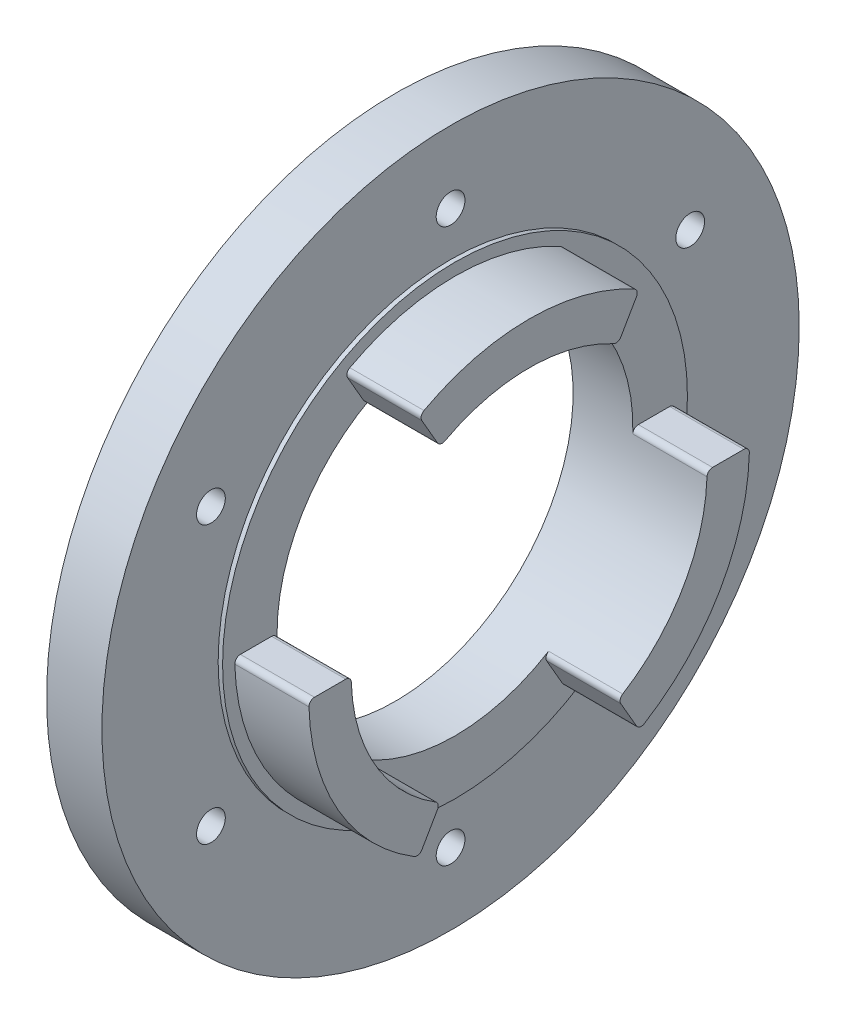
ISO-10303-21;
HEADER;
FILE_DESCRIPTION(('STEP AP214'),'2;1');
FILE_NAME('part.step','',(''),(''),'','','');
FILE_SCHEMA(('AUTOMOTIVE_DESIGN { 1 0 10303 214 1 1 1 1 }'));
ENDSEC;
DATA;
#1=APPLICATION_CONTEXT('core data for automotive mechanical design processes');
#2=APPLICATION_PROTOCOL_DEFINITION('international standard','automotive_design',2000,#1);
#3=PRODUCT_CONTEXT('',#1,'mechanical');
#4=PRODUCT('Part','Part','',(#3));
#5=PRODUCT_RELATED_PRODUCT_CATEGORY('part','',(#4));
#6=PRODUCT_DEFINITION_FORMATION('','',#4);
#7=PRODUCT_DEFINITION_CONTEXT('part definition',#1,'design');
#8=PRODUCT_DEFINITION('design','',#6,#7);
#9=PRODUCT_DEFINITION_SHAPE('','',#8);
#10=(LENGTH_UNIT() NAMED_UNIT(*) SI_UNIT(.MILLI.,.METRE.));
#11=(NAMED_UNIT(*) PLANE_ANGLE_UNIT() SI_UNIT($,.RADIAN.));
#12=(NAMED_UNIT(*) SI_UNIT($,.STERADIAN.) SOLID_ANGLE_UNIT());
#13=UNCERTAINTY_MEASURE_WITH_UNIT(LENGTH_MEASURE(1.E-05),#10,'distance_accuracy_value','');
#14=(GEOMETRIC_REPRESENTATION_CONTEXT(3) GLOBAL_UNCERTAINTY_ASSIGNED_CONTEXT((#13)) GLOBAL_UNIT_ASSIGNED_CONTEXT((#10,
#11,#12)) REPRESENTATION_CONTEXT('',''));
#15=CARTESIAN_POINT('',(0.,0.,0.));
#16=DIRECTION('',(0.,0.,1.));
#17=DIRECTION('',(1.,0.,0.));
#18=AXIS2_PLACEMENT_3D('',#15,#16,#17);
#19=CARTESIAN_POINT('',(0.,0.,0.));
#20=DIRECTION('',(-1.,0.,0.));
#21=DIRECTION('',(0.,0.,1.));
#22=AXIS2_PLACEMENT_3D('',#19,#20,#21);
#23=PLANE('',#22);
#24=CARTESIAN_POINT('',(0.,12.5000000000003,21.6506350946108));
#25=DIRECTION('',(1.,0.,0.));
#26=DIRECTION('',(0.,0.,-1.));
#27=AXIS2_PLACEMENT_3D('',#24,#25,#26);
#28=CIRCLE('',#27,1.29999999999999);
#29=CARTESIAN_POINT('',(0.,12.5000000000003,20.3506350946108));
#30=VERTEX_POINT('',#29);
#31=EDGE_CURVE('E241',#30,#30,#28,.T.);
#32=ORIENTED_EDGE('',*,*,#31,.T.);
#33=EDGE_LOOP('',(#32));
#34=FACE_BOUND('',#33,.T.);
#35=CARTESIAN_POINT('',(0.,-12.4999999999998,21.6506350946111));
#36=DIRECTION('',(1.,0.,0.));
#37=DIRECTION('',(0.,0.,-1.));
#38=AXIS2_PLACEMENT_3D('',#35,#36,#37);
#39=CIRCLE('',#38,1.29999999999999);
#40=CARTESIAN_POINT('',(0.,-12.4999999999998,20.3506350946111));
#41=VERTEX_POINT('',#40);
#42=EDGE_CURVE('E250',#41,#41,#39,.T.);
#43=ORIENTED_EDGE('',*,*,#42,.T.);
#44=EDGE_LOOP('',(#43));
#45=FACE_BOUND('',#44,.T.);
#46=CARTESIAN_POINT('',(0.,-25.,0.));
#47=DIRECTION('',(1.,0.,0.));
#48=DIRECTION('',(0.,0.,-1.));
#49=AXIS2_PLACEMENT_3D('',#46,#47,#48);
#50=CIRCLE('',#49,1.29999999999999);
#51=CARTESIAN_POINT('',(0.,-25.,-1.29999999999999));
#52=VERTEX_POINT('',#51);
#53=EDGE_CURVE('E254',#52,#52,#50,.T.);
#54=ORIENTED_EDGE('',*,*,#53,.T.);
#55=EDGE_LOOP('',(#54));
#56=FACE_BOUND('',#55,.T.);
#57=CARTESIAN_POINT('',(0.,-12.5000000000001,-21.6506350946109));
#58=DIRECTION('',(1.,0.,0.));
#59=DIRECTION('',(0.,0.,-1.));
#60=AXIS2_PLACEMENT_3D('',#57,#58,#59);
#61=CIRCLE('',#60,1.29999999999999);
#62=CARTESIAN_POINT('',(0.,-12.5000000000001,-22.9506350946109));
#63=VERTEX_POINT('',#62);
#64=EDGE_CURVE('E258',#63,#63,#61,.T.);
#65=ORIENTED_EDGE('',*,*,#64,.T.);
#66=EDGE_LOOP('',(#65));
#67=FACE_BOUND('',#66,.T.);
#68=CARTESIAN_POINT('',(0.,12.5,-21.650635094611));
#69=DIRECTION('',(1.,0.,0.));
#70=DIRECTION('',(0.,0.,-1.));
#71=AXIS2_PLACEMENT_3D('',#68,#69,#70);
#72=CIRCLE('',#71,1.29999999999999);
#73=CARTESIAN_POINT('',(0.,12.5,-22.950635094611));
#74=VERTEX_POINT('',#73);
#75=EDGE_CURVE('E264',#74,#74,#72,.T.);
#76=ORIENTED_EDGE('',*,*,#75,.T.);
#77=EDGE_LOOP('',(#76));
#78=FACE_BOUND('',#77,.T.);
#79=CARTESIAN_POINT('',(0.,25.,0.));
#80=DIRECTION('',(1.,0.,0.));
#81=DIRECTION('',(0.,0.,-1.));
#82=AXIS2_PLACEMENT_3D('',#79,#80,#81);
#83=CIRCLE('',#82,1.29999999999999);
#84=CARTESIAN_POINT('',(0.,25.,-1.29999999999999));
#85=VERTEX_POINT('',#84);
#86=EDGE_CURVE('E272',#85,#85,#83,.T.);
#87=ORIENTED_EDGE('',*,*,#86,.T.);
#88=EDGE_LOOP('',(#87));
#89=FACE_BOUND('',#88,.T.);
#90=CARTESIAN_POINT('',(0.,0.,0.));
#91=DIRECTION('',(-1.,0.,0.));
#92=DIRECTION('',(0.,0.,1.));
#93=AXIS2_PLACEMENT_3D('',#90,#91,#92);
#94=CIRCLE('',#93,16.075);
#95=CARTESIAN_POINT('',(0.,0.,16.075));
#96=VERTEX_POINT('',#95);
#97=EDGE_CURVE('E274',#96,#96,#94,.T.);
#98=ORIENTED_EDGE('',*,*,#97,.F.);
#99=EDGE_LOOP('',(#98));
#100=FACE_BOUND('',#99,.T.);
#101=CARTESIAN_POINT('',(0.,0.,0.));
#102=DIRECTION('',(1.,0.,0.));
#103=DIRECTION('',(0.,0.,-1.));
#104=AXIS2_PLACEMENT_3D('',#101,#102,#103);
#105=CIRCLE('',#104,31.5);
#106=CARTESIAN_POINT('',(0.,0.,-31.5));
#107=VERTEX_POINT('',#106);
#108=EDGE_CURVE('E288',#107,#107,#105,.T.);
#109=ORIENTED_EDGE('',*,*,#108,.F.);
#110=EDGE_LOOP('',(#109));
#111=FACE_BOUND('',#110,.T.);
#112=ADVANCED_FACE('F41',(#34,#45,#56,#67,#78,#89,#100,#111),#23,.T.);
#113=CARTESIAN_POINT('',(0.,0.,0.));
#114=DIRECTION('',(1.,0.,0.));
#115=DIRECTION('',(0.,0.,-1.));
#116=AXIS2_PLACEMENT_3D('',#113,#114,#115);
#117=CYLINDRICAL_SURFACE('',#116,31.5);
#118=ORIENTED_EDGE('',*,*,#108,.T.);
#119=EDGE_LOOP('',(#118));
#120=FACE_BOUND('',#119,.T.);
#121=CARTESIAN_POINT('',(5.,0.,0.));
#122=DIRECTION('',(1.,0.,0.));
#123=DIRECTION('',(0.,0.,-1.));
#124=AXIS2_PLACEMENT_3D('',#121,#122,#123);
#125=CIRCLE('',#124,31.5);
#126=CARTESIAN_POINT('',(5.,0.,-31.5));
#127=VERTEX_POINT('',#126);
#128=EDGE_CURVE('E290',#127,#127,#125,.T.);
#129=ORIENTED_EDGE('',*,*,#128,.F.);
#130=EDGE_LOOP('',(#129));
#131=FACE_BOUND('',#130,.T.);
#132=ADVANCED_FACE('F523',(#120,#131),#117,.T.);
#133=CARTESIAN_POINT('',(5.,31.5,0.));
#134=DIRECTION('',(1.,0.,0.));
#135=DIRECTION('',(0.,0.,-1.));
#136=AXIS2_PLACEMENT_3D('',#133,#134,#135);
#137=PLANE('',#136);
#138=CARTESIAN_POINT('',(5.,12.5000000000003,21.6506350946108));
#139=DIRECTION('',(1.,0.,0.));
#140=DIRECTION('',(0.,0.,-1.));
#141=AXIS2_PLACEMENT_3D('',#138,#139,#140);
#142=CIRCLE('',#141,1.29999999999999);
#143=CARTESIAN_POINT('',(5.,12.5000000000003,20.3506350946108));
#144=VERTEX_POINT('',#143);
#145=EDGE_CURVE('E238',#144,#144,#142,.T.);
#146=ORIENTED_EDGE('',*,*,#145,.F.);
#147=EDGE_LOOP('',(#146));
#148=FACE_BOUND('',#147,.T.);
#149=CARTESIAN_POINT('',(5.,-12.4999999999998,21.6506350946111));
#150=DIRECTION('',(1.,0.,0.));
#151=DIRECTION('',(0.,0.,-1.));
#152=AXIS2_PLACEMENT_3D('',#149,#150,#151);
#153=CIRCLE('',#152,1.29999999999999);
#154=CARTESIAN_POINT('',(5.,-12.4999999999998,20.3506350946111));
#155=VERTEX_POINT('',#154);
#156=EDGE_CURVE('E242',#155,#155,#153,.T.);
#157=ORIENTED_EDGE('',*,*,#156,.F.);
#158=EDGE_LOOP('',(#157));
#159=FACE_BOUND('',#158,.T.);
#160=CARTESIAN_POINT('',(5.,-25.,0.));
#161=DIRECTION('',(1.,0.,0.));
#162=DIRECTION('',(0.,0.,-1.));
#163=AXIS2_PLACEMENT_3D('',#160,#161,#162);
#164=CIRCLE('',#163,1.29999999999999);
#165=CARTESIAN_POINT('',(5.,-25.,-1.29999999999999));
#166=VERTEX_POINT('',#165);
#167=EDGE_CURVE('E249',#166,#166,#164,.T.);
#168=ORIENTED_EDGE('',*,*,#167,.F.);
#169=EDGE_LOOP('',(#168));
#170=FACE_BOUND('',#169,.T.);
#171=CARTESIAN_POINT('',(5.,-12.5000000000001,-21.6506350946109));
#172=DIRECTION('',(1.,0.,0.));
#173=DIRECTION('',(0.,0.,-1.));
#174=AXIS2_PLACEMENT_3D('',#171,#172,#173);
#175=CIRCLE('',#174,1.29999999999999);
#176=CARTESIAN_POINT('',(5.,-12.5000000000001,-22.9506350946109));
#177=VERTEX_POINT('',#176);
#178=EDGE_CURVE('E259',#177,#177,#175,.T.);
#179=ORIENTED_EDGE('',*,*,#178,.F.);
#180=EDGE_LOOP('',(#179));
#181=FACE_BOUND('',#180,.T.);
#182=CARTESIAN_POINT('',(5.,12.5,-21.650635094611));
#183=DIRECTION('',(1.,0.,0.));
#184=DIRECTION('',(0.,0.,-1.));
#185=AXIS2_PLACEMENT_3D('',#182,#183,#184);
#186=CIRCLE('',#185,1.29999999999999);
#187=CARTESIAN_POINT('',(5.,12.5,-22.950635094611));
#188=VERTEX_POINT('',#187);
#189=EDGE_CURVE('E265',#188,#188,#186,.T.);
#190=ORIENTED_EDGE('',*,*,#189,.F.);
#191=EDGE_LOOP('',(#190));
#192=FACE_BOUND('',#191,.T.);
#193=CARTESIAN_POINT('',(5.,25.,0.));
#194=DIRECTION('',(1.,0.,0.));
#195=DIRECTION('',(0.,0.,-1.));
#196=AXIS2_PLACEMENT_3D('',#193,#194,#195);
#197=CIRCLE('',#196,1.29999999999999);
#198=CARTESIAN_POINT('',(5.,25.,-1.29999999999999));
#199=VERTEX_POINT('',#198);
#200=EDGE_CURVE('E269',#199,#199,#197,.T.);
#201=ORIENTED_EDGE('',*,*,#200,.F.);
#202=EDGE_LOOP('',(#201));
#203=FACE_BOUND('',#202,.T.);
#204=ORIENTED_EDGE('',*,*,#128,.T.);
#205=EDGE_LOOP('',(#204));
#206=FACE_BOUND('',#205,.T.);
#207=CARTESIAN_POINT('',(5.,0.,0.));
#208=DIRECTION('',(1.,0.,0.));
#209=DIRECTION('',(0.,0.,-1.));
#210=AXIS2_PLACEMENT_3D('',#207,#208,#209);
#211=CIRCLE('',#210,21.);
#212=CARTESIAN_POINT('',(5.,0.,-21.));
#213=VERTEX_POINT('',#212);
#214=EDGE_CURVE('E282',#213,#213,#211,.T.);
#215=ORIENTED_EDGE('',*,*,#214,.F.);
#216=EDGE_LOOP('',(#215));
#217=FACE_BOUND('',#216,.T.);
#218=ADVANCED_FACE('F532',(#148,#159,#170,#181,#192,#203,#206,#217),#137,.T.);
#219=CARTESIAN_POINT('',(0.,0.,0.));
#220=DIRECTION('',(1.,0.,0.));
#221=DIRECTION('',(0.,0.,-1.));
#222=AXIS2_PLACEMENT_3D('',#219,#220,#221);
#223=CYLINDRICAL_SURFACE('',#222,21.);
#224=ORIENTED_EDGE('',*,*,#214,.T.);
#225=EDGE_LOOP('',(#224));
#226=FACE_BOUND('',#225,.T.);
#227=CARTESIAN_POINT('',(5.4,0.,0.));
#228=DIRECTION('',(1.,0.,0.));
#229=DIRECTION('',(0.,0.,-1.));
#230=AXIS2_PLACEMENT_3D('',#227,#228,#229);
#231=CIRCLE('',#230,21.);
#232=CARTESIAN_POINT('',(5.4,0.,-21.));
#233=VERTEX_POINT('',#232);
#234=EDGE_CURVE('E276',#233,#233,#231,.T.);
#235=ORIENTED_EDGE('',*,*,#234,.F.);
#236=EDGE_LOOP('',(#235));
#237=FACE_BOUND('',#236,.T.);
#238=ADVANCED_FACE('F536',(#226,#237),#223,.T.);
#239=CARTESIAN_POINT('',(5.4,21.,0.));
#240=DIRECTION('',(1.,0.,0.));
#241=DIRECTION('',(0.,0.,-1.));
#242=AXIS2_PLACEMENT_3D('',#239,#240,#241);
#243=PLANE('',#242);
#244=DIRECTION('',(0.,0.,1.));
#245=VECTOR('',#244,1.);
#246=CARTESIAN_POINT('',(5.4,0.,19.9));
#247=LINE('',#246,#245);
#248=CARTESIAN_POINT('',(5.4,0.,16.5674568054364));
#249=VERTEX_POINT('',#248);
#250=CARTESIAN_POINT('',(5.4,0.,19.3935556306728));
#251=VERTEX_POINT('',#250);
#252=EDGE_CURVE('E449',#249,#251,#247,.T.);
#253=ORIENTED_EDGE('',*,*,#252,.F.);
#254=CARTESIAN_POINT('',(5.4,-0.500000000000061,16.5674568054364));
#255=DIRECTION('',(1.,0.,0.));
#256=DIRECTION('',(0.,0.,-1.));
#257=AXIS2_PLACEMENT_3D('',#254,#255,#256);
#258=CIRCLE('',#257,0.5);
#259=CARTESIAN_POINT('',(5.4,-0.484917043740632,16.0676843527837));
#260=VERTEX_POINT('',#259);
#261=EDGE_CURVE('E350',#249,#260,#258,.F.);
#262=ORIENTED_EDGE('',*,*,#261,.T.);
#263=CARTESIAN_POINT('',(5.4,0.,0.));
#264=DIRECTION('',(-1.,0.,0.));
#265=DIRECTION('',(0.,0.,1.));
#266=AXIS2_PLACEMENT_3D('',#263,#264,#265);
#267=CIRCLE('',#266,16.075);
#268=CARTESIAN_POINT('',(5.4,14.1574813513707,7.61389169778447));
#269=VERTEX_POINT('',#268);
#270=EDGE_CURVE('E278',#260,#269,#267,.T.);
#271=ORIENTED_EDGE('',*,*,#270,.T.);
#272=CARTESIAN_POINT('',(5.4,14.5978384696093,7.85071570082598));
#273=DIRECTION('',(1.,0.,0.));
#274=DIRECTION('',(0.,0.,-1.));
#275=AXIS2_PLACEMENT_3D('',#272,#273,#274);
#276=CIRCLE('',#275,0.5);
#277=CARTESIAN_POINT('',(5.4,14.3478384696093,8.2837284027182));
#278=VERTEX_POINT('',#277);
#279=EDGE_CURVE('E320',#269,#278,#276,.F.);
#280=ORIENTED_EDGE('',*,*,#279,.T.);
#281=DIRECTION('',(0.,-0.866025403784438,-0.500000000000001));
#282=VECTOR('',#281,1.);
#283=CARTESIAN_POINT('',(5.4,17.2339055353103,9.95000000000002));
#284=LINE('',#283,#282);
#285=CARTESIAN_POINT('',(5.4,16.7953118458694,9.69677781533641));
#286=VERTEX_POINT('',#285);
#287=EDGE_CURVE('E226',#286,#278,#284,.T.);
#288=ORIENTED_EDGE('',*,*,#287,.F.);
#289=CARTESIAN_POINT('',(5.4,17.0453118458694,9.26376511344419));
#290=DIRECTION('',(1.,0.,0.));
#291=DIRECTION('',(0.,0.,-1.));
#292=AXIS2_PLACEMENT_3D('',#289,#290,#291);
#293=CIRCLE('',#292,0.5);
#294=CARTESIAN_POINT('',(5.4,17.4846240068454,9.50252194626492));
#295=VERTEX_POINT('',#294);
#296=EDGE_CURVE('E314',#286,#295,#293,.F.);
#297=ORIENTED_EDGE('',*,*,#296,.T.);
#298=CARTESIAN_POINT('',(5.4,0.,0.));
#299=DIRECTION('',(1.,0.,0.));
#300=DIRECTION('',(0.,0.,-1.));
#301=AXIS2_PLACEMENT_3D('',#298,#299,#300);
#302=CIRCLE('',#301,19.9);
#303=CARTESIAN_POINT('',(5.4,17.4846240068454,-9.50252194626492));
#304=VERTEX_POINT('',#303);
#305=EDGE_CURVE('E234',#304,#295,#302,.T.);
#306=ORIENTED_EDGE('',*,*,#305,.F.);
#307=CARTESIAN_POINT('',(5.4,17.0453118458694,-9.26376511344419));
#308=DIRECTION('',(1.,0.,0.));
#309=DIRECTION('',(0.,0.,-1.));
#310=AXIS2_PLACEMENT_3D('',#307,#308,#309);
#311=CIRCLE('',#310,0.5);
#312=CARTESIAN_POINT('',(5.4,16.7953118458694,-9.69677781533641));
#313=VERTEX_POINT('',#312);
#314=EDGE_CURVE('E209',#304,#313,#311,.F.);
#315=ORIENTED_EDGE('',*,*,#314,.T.);
#316=DIRECTION('',(0.,0.866025403784438,-0.500000000000001));
#317=VECTOR('',#316,1.);
#318=CARTESIAN_POINT('',(5.4,17.2339055353103,-9.95000000000002));
#319=LINE('',#318,#317);
#320=CARTESIAN_POINT('',(5.4,14.3478384696093,-8.2837284027182));
#321=VERTEX_POINT('',#320);
#322=EDGE_CURVE('E216',#321,#313,#319,.T.);
#323=ORIENTED_EDGE('',*,*,#322,.F.);
#324=CARTESIAN_POINT('',(5.4,14.5978384696093,-7.85071570082598));
#325=DIRECTION('',(1.,0.,0.));
#326=DIRECTION('',(0.,0.,-1.));
#327=AXIS2_PLACEMENT_3D('',#324,#325,#326);
#328=CIRCLE('',#327,0.5);
#329=CARTESIAN_POINT('',(5.4,14.1574813513707,-7.61389169778447));
#330=VERTEX_POINT('',#329);
#331=EDGE_CURVE('E205',#321,#330,#328,.F.);
#332=ORIENTED_EDGE('',*,*,#331,.T.);
#333=CARTESIAN_POINT('',(5.4,-0.484917043740404,-16.0676843527837));
#334=VERTEX_POINT('',#333);
#335=EDGE_CURVE('E273',#330,#334,#267,.T.);
#336=ORIENTED_EDGE('',*,*,#335,.T.);
#337=CARTESIAN_POINT('',(5.4,-0.499999999999826,-16.5674568054364));
#338=DIRECTION('',(1.,0.,0.));
#339=DIRECTION('',(0.,0.,-1.));
#340=AXIS2_PLACEMENT_3D('',#337,#338,#339);
#341=CIRCLE('',#340,0.5);
#342=CARTESIAN_POINT('',(5.4,1.74313041522981E-13,-16.5674568054364));
#343=VERTEX_POINT('',#342);
#344=EDGE_CURVE('E11',#334,#343,#341,.F.);
#345=ORIENTED_EDGE('',*,*,#344,.T.);
#346=DIRECTION('',(0.,0.,1.));
#347=VECTOR('',#346,1.);
#348=CARTESIAN_POINT('',(5.4,2.08166817117217E-13,-19.9));
#349=LINE('',#348,#347);
#350=CARTESIAN_POINT('',(5.4,2.03022081391619E-13,-19.3935556306728));
#351=VERTEX_POINT('',#350);
#352=EDGE_CURVE('E387',#351,#343,#349,.T.);
#353=ORIENTED_EDGE('',*,*,#352,.F.);
#354=CARTESIAN_POINT('',(5.4,-0.499999999999797,-19.3935556306728));
#355=DIRECTION('',(1.,0.,0.));
#356=DIRECTION('',(0.,0.,-1.));
#357=AXIS2_PLACEMENT_3D('',#354,#355,#356);
#358=CIRCLE('',#357,0.5);
#359=CARTESIAN_POINT('',(5.4,-0.512886597937936,-19.8933895386798));
#360=VERTEX_POINT('',#359);
#361=EDGE_CURVE('E47',#351,#360,#358,.F.);
#362=ORIENTED_EDGE('',*,*,#361,.T.);
#363=CARTESIAN_POINT('',(5.4,0.,0.));
#364=DIRECTION('',(1.,0.,0.));
#365=DIRECTION('',(0.,-0.866025403784443,0.499999999999992));
#366=AXIS2_PLACEMENT_3D('',#363,#364,#365);
#367=CIRCLE('',#366,19.9);
#368=CARTESIAN_POINT('',(5.4,-16.9717374089072,-10.3908675924151));
#369=VERTEX_POINT('',#368);
#370=EDGE_CURVE('E388',#369,#360,#367,.T.);
#371=ORIENTED_EDGE('',*,*,#370,.F.);
#372=CARTESIAN_POINT('',(5.4,-16.5453118458693,-10.1297905172287));
#373=DIRECTION('',(1.,0.,0.));
#374=DIRECTION('',(0.,0.,-1.));
#375=AXIS2_PLACEMENT_3D('',#372,#373,#374);
#376=CIRCLE('',#375,0.5);
#377=CARTESIAN_POINT('',(5.4,-16.7953118458693,-9.69677781533653));
#378=VERTEX_POINT('',#377);
#379=EDGE_CURVE('E389',#369,#378,#376,.F.);
#380=ORIENTED_EDGE('',*,*,#379,.T.);
#381=DIRECTION('',(0.,-0.866025403784435,-0.500000000000007));
#382=VECTOR('',#381,1.);
#383=CARTESIAN_POINT('',(5.4,-17.2339055353102,-9.95000000000014));
#384=LINE('',#383,#382);
#385=CARTESIAN_POINT('',(5.4,-14.3478384696092,-8.2837284027183));
#386=VERTEX_POINT('',#385);
#387=EDGE_CURVE('E412',#386,#378,#384,.T.);
#388=ORIENTED_EDGE('',*,*,#387,.F.);
#389=CARTESIAN_POINT('',(5.4,-14.0978384696092,-8.71674110461052));
#390=DIRECTION('',(1.,0.,0.));
#391=DIRECTION('',(0.,0.,-1.));
#392=AXIS2_PLACEMENT_3D('',#389,#390,#391);
#393=CIRCLE('',#392,0.5);
#394=CARTESIAN_POINT('',(5.4,-13.67256430763,-8.45379265499935));
#395=VERTEX_POINT('',#394);
#396=EDGE_CURVE('E384',#386,#395,#393,.F.);
#397=ORIENTED_EDGE('',*,*,#396,.T.);
#398=CARTESIAN_POINT('',(5.4,-13.6725643076302,8.45379265499915));
#399=VERTEX_POINT('',#398);
#400=EDGE_CURVE('E280',#395,#399,#267,.T.);
#401=ORIENTED_EDGE('',*,*,#400,.T.);
#402=CARTESIAN_POINT('',(5.4,-14.0978384696093,8.71674110461032));
#403=DIRECTION('',(1.,0.,0.));
#404=DIRECTION('',(0.,0.,-1.));
#405=AXIS2_PLACEMENT_3D('',#402,#403,#404);
#406=CIRCLE('',#405,0.5);
#407=CARTESIAN_POINT('',(5.4,-14.3478384696093,8.2837284027181));
#408=VERTEX_POINT('',#407);
#409=EDGE_CURVE('E351',#399,#408,#406,.F.);
#410=ORIENTED_EDGE('',*,*,#409,.T.);
#411=DIRECTION('',(0.,0.866025403784442,-0.499999999999995));
#412=VECTOR('',#411,1.);
#413=CARTESIAN_POINT('',(5.4,-17.2339055353104,9.9499999999999));
#414=LINE('',#413,#412);
#415=CARTESIAN_POINT('',(5.4,-16.7953118458694,9.69677781533629));
#416=VERTEX_POINT('',#415);
#417=EDGE_CURVE('E447',#416,#408,#414,.T.);
#418=ORIENTED_EDGE('',*,*,#417,.F.);
#419=CARTESIAN_POINT('',(5.4,-16.5453118458694,10.1297905172285));
#420=DIRECTION('',(1.,0.,0.));
#421=DIRECTION('',(0.,0.,-1.));
#422=AXIS2_PLACEMENT_3D('',#419,#420,#421);
#423=CIRCLE('',#422,0.5);
#424=CARTESIAN_POINT('',(5.4,-16.9717374089073,10.3908675924148));
#425=VERTEX_POINT('',#424);
#426=EDGE_CURVE('E355',#416,#425,#423,.F.);
#427=ORIENTED_EDGE('',*,*,#426,.T.);
#428=CARTESIAN_POINT('',(5.4,0.,0.));
#429=DIRECTION('',(1.,0.,0.));
#430=DIRECTION('',(0.,0.866025403784436,0.500000000000004));
#431=AXIS2_PLACEMENT_3D('',#428,#429,#430);
#432=CIRCLE('',#431,19.9);
#433=CARTESIAN_POINT('',(5.4,-0.512886597938216,19.8933895386798));
#434=VERTEX_POINT('',#433);
#435=EDGE_CURVE('E416',#434,#425,#432,.T.);
#436=ORIENTED_EDGE('',*,*,#435,.F.);
#437=CARTESIAN_POINT('',(5.4,-0.500000000000069,19.3935556306728));
#438=DIRECTION('',(1.,0.,0.));
#439=DIRECTION('',(0.,0.,-1.));
#440=AXIS2_PLACEMENT_3D('',#437,#438,#439);
#441=CIRCLE('',#440,0.5);
#442=EDGE_CURVE('E349',#434,#251,#441,.F.);
#443=ORIENTED_EDGE('',*,*,#442,.T.);
#444=EDGE_LOOP('',(#253,#262,#271,#280,#288,#297,#306,#315,#323,#332,#336,#345,#353,#362,#371,
#380,#388,#397,#401,#410,#418,#427,#436,#443));
#445=FACE_BOUND('',#444,.T.);
#446=ORIENTED_EDGE('',*,*,#234,.T.);
#447=EDGE_LOOP('',(#446));
#448=FACE_BOUND('',#447,.T.);
#449=ADVANCED_FACE('F221',(#445,#448),#243,.T.);
#450=CARTESIAN_POINT('',(5.4,0.,0.));
#451=DIRECTION('',(-1.,0.,0.));
#452=DIRECTION('',(0.,0.,1.));
#453=AXIS2_PLACEMENT_3D('',#450,#451,#452);
#454=CYLINDRICAL_SURFACE('',#453,16.075);
#455=ORIENTED_EDGE('',*,*,#400,.F.);
#456=DIRECTION('',(-1.,0.,0.));
#457=VECTOR('',#456,1.);
#458=CARTESIAN_POINT('',(5.4,-13.67256430763,-8.45379265499934));
#459=LINE('',#458,#457);
#460=CARTESIAN_POINT('',(12.1,-13.67256430763,-8.45379265499935));
#461=VERTEX_POINT('',#460);
#462=EDGE_CURVE('E364',#395,#461,#459,.F.);
#463=ORIENTED_EDGE('',*,*,#462,.T.);
#464=CARTESIAN_POINT('',(12.1,0.,0.));
#465=DIRECTION('',(-1.,0.,0.));
#466=DIRECTION('',(0.,-0.866025403784443,0.499999999999992));
#467=AXIS2_PLACEMENT_3D('',#464,#465,#466);
#468=CIRCLE('',#467,16.075);
#469=CARTESIAN_POINT('',(12.1,-0.484917043740404,-16.0676843527837));
#470=VERTEX_POINT('',#469);
#471=EDGE_CURVE('E407',#470,#461,#468,.T.);
#472=ORIENTED_EDGE('',*,*,#471,.F.);
#473=DIRECTION('',(-1.,0.,0.));
#474=VECTOR('',#473,1.);
#475=CARTESIAN_POINT('',(5.4,-0.484917043740404,-16.0676843527837));
#476=LINE('',#475,#474);
#477=EDGE_CURVE('E363',#470,#334,#476,.T.);
#478=ORIENTED_EDGE('',*,*,#477,.T.);
#479=ORIENTED_EDGE('',*,*,#335,.F.);
#480=DIRECTION('',(-1.,0.,0.));
#481=VECTOR('',#480,1.);
#482=CARTESIAN_POINT('',(5.4,14.1574813513707,-7.61389169778447));
#483=LINE('',#482,#481);
#484=CARTESIAN_POINT('',(12.1,14.1574813513707,-7.61389169778447));
#485=VERTEX_POINT('',#484);
#486=EDGE_CURVE('E210',#330,#485,#483,.F.);
#487=ORIENTED_EDGE('',*,*,#486,.T.);
#488=CARTESIAN_POINT('',(12.1,0.,0.));
#489=DIRECTION('',(-1.,0.,0.));
#490=DIRECTION('',(0.,0.,-1.));
#491=AXIS2_PLACEMENT_3D('',#488,#489,#490);
#492=CIRCLE('',#491,16.075);
#493=CARTESIAN_POINT('',(12.1,14.1574813513707,7.61389169778447));
#494=VERTEX_POINT('',#493);
#495=EDGE_CURVE('E428',#494,#485,#492,.T.);
#496=ORIENTED_EDGE('',*,*,#495,.F.);
#497=DIRECTION('',(-1.,0.,0.));
#498=VECTOR('',#497,1.);
#499=CARTESIAN_POINT('',(5.4,14.1574813513707,7.61389169778447));
#500=LINE('',#499,#498);
#501=EDGE_CURVE('E219',#494,#269,#500,.T.);
#502=ORIENTED_EDGE('',*,*,#501,.T.);
#503=ORIENTED_EDGE('',*,*,#270,.F.);
#504=DIRECTION('',(-1.,0.,0.));
#505=VECTOR('',#504,1.);
#506=CARTESIAN_POINT('',(5.4,-0.484917043740632,16.0676843527837));
#507=LINE('',#506,#505);
#508=CARTESIAN_POINT('',(12.1,-0.484917043740632,16.0676843527837));
#509=VERTEX_POINT('',#508);
#510=EDGE_CURVE('E330',#260,#509,#507,.F.);
#511=ORIENTED_EDGE('',*,*,#510,.T.);
#512=CARTESIAN_POINT('',(12.1,0.,0.));
#513=DIRECTION('',(-1.,0.,0.));
#514=DIRECTION('',(0.,0.866025403784436,0.500000000000004));
#515=AXIS2_PLACEMENT_3D('',#512,#513,#514);
#516=CIRCLE('',#515,16.075);
#517=CARTESIAN_POINT('',(12.1,-13.6725643076302,8.45379265499915));
#518=VERTEX_POINT('',#517);
#519=EDGE_CURVE('E432',#518,#509,#516,.T.);
#520=ORIENTED_EDGE('',*,*,#519,.F.);
#521=DIRECTION('',(-1.,0.,0.));
#522=VECTOR('',#521,1.);
#523=CARTESIAN_POINT('',(5.4,-13.6725643076302,8.45379265499915));
#524=LINE('',#523,#522);
#525=EDGE_CURVE('E323',#518,#399,#524,.T.);
#526=ORIENTED_EDGE('',*,*,#525,.T.);
#527=EDGE_LOOP('',(#455,#463,#472,#478,#479,#487,#496,#502,#503,#511,#520,#526));
#528=FACE_BOUND('',#527,.T.);
#529=ORIENTED_EDGE('',*,*,#97,.T.);
#530=EDGE_LOOP('',(#529));
#531=FACE_BOUND('',#530,.T.);
#532=ADVANCED_FACE('F468',(#528,#531),#454,.F.);
#533=CARTESIAN_POINT('',(5.,25.,0.));
#534=DIRECTION('',(1.,0.,0.));
#535=DIRECTION('',(0.,0.,-1.));
#536=AXIS2_PLACEMENT_3D('',#533,#534,#535);
#537=CYLINDRICAL_SURFACE('',#536,1.29999999999999);
#538=ORIENTED_EDGE('',*,*,#86,.F.);
#539=EDGE_LOOP('',(#538));
#540=FACE_BOUND('',#539,.T.);
#541=ORIENTED_EDGE('',*,*,#200,.T.);
#542=EDGE_LOOP('',(#541));
#543=FACE_BOUND('',#542,.T.);
#544=ADVANCED_FACE('F547',(#540,#543),#537,.F.);
#545=CARTESIAN_POINT('',(5.,12.5,-21.650635094611));
#546=DIRECTION('',(1.,0.,0.));
#547=DIRECTION('',(0.,0.,-1.));
#548=AXIS2_PLACEMENT_3D('',#545,#546,#547);
#549=CYLINDRICAL_SURFACE('',#548,1.29999999999999);
#550=ORIENTED_EDGE('',*,*,#75,.F.);
#551=EDGE_LOOP('',(#550));
#552=FACE_BOUND('',#551,.T.);
#553=ORIENTED_EDGE('',*,*,#189,.T.);
#554=EDGE_LOOP('',(#553));
#555=FACE_BOUND('',#554,.T.);
#556=ADVANCED_FACE('F549',(#552,#555),#549,.F.);
#557=CARTESIAN_POINT('',(5.,-12.5000000000001,-21.6506350946109));
#558=DIRECTION('',(1.,0.,0.));
#559=DIRECTION('',(0.,0.,-1.));
#560=AXIS2_PLACEMENT_3D('',#557,#558,#559);
#561=CYLINDRICAL_SURFACE('',#560,1.29999999999999);
#562=ORIENTED_EDGE('',*,*,#64,.F.);
#563=EDGE_LOOP('',(#562));
#564=FACE_BOUND('',#563,.T.);
#565=ORIENTED_EDGE('',*,*,#178,.T.);
#566=EDGE_LOOP('',(#565));
#567=FACE_BOUND('',#566,.T.);
#568=ADVANCED_FACE('F552',(#564,#567),#561,.F.);
#569=CARTESIAN_POINT('',(5.,-25.,0.));
#570=DIRECTION('',(1.,0.,0.));
#571=DIRECTION('',(0.,0.,-1.));
#572=AXIS2_PLACEMENT_3D('',#569,#570,#571);
#573=CYLINDRICAL_SURFACE('',#572,1.29999999999999);
#574=ORIENTED_EDGE('',*,*,#53,.F.);
#575=EDGE_LOOP('',(#574));
#576=FACE_BOUND('',#575,.T.);
#577=ORIENTED_EDGE('',*,*,#167,.T.);
#578=EDGE_LOOP('',(#577));
#579=FACE_BOUND('',#578,.T.);
#580=ADVANCED_FACE('F558',(#576,#579),#573,.F.);
#581=CARTESIAN_POINT('',(5.,-12.4999999999998,21.6506350946111));
#582=DIRECTION('',(1.,0.,0.));
#583=DIRECTION('',(0.,0.,-1.));
#584=AXIS2_PLACEMENT_3D('',#581,#582,#583);
#585=CYLINDRICAL_SURFACE('',#584,1.29999999999999);
#586=ORIENTED_EDGE('',*,*,#42,.F.);
#587=EDGE_LOOP('',(#586));
#588=FACE_BOUND('',#587,.T.);
#589=ORIENTED_EDGE('',*,*,#156,.T.);
#590=EDGE_LOOP('',(#589));
#591=FACE_BOUND('',#590,.T.);
#592=ADVANCED_FACE('F557',(#588,#591),#585,.F.);
#593=CARTESIAN_POINT('',(5.,12.5000000000003,21.6506350946108));
#594=DIRECTION('',(1.,0.,0.));
#595=DIRECTION('',(0.,0.,-1.));
#596=AXIS2_PLACEMENT_3D('',#593,#594,#595);
#597=CYLINDRICAL_SURFACE('',#596,1.29999999999999);
#598=ORIENTED_EDGE('',*,*,#31,.F.);
#599=EDGE_LOOP('',(#598));
#600=FACE_BOUND('',#599,.T.);
#601=ORIENTED_EDGE('',*,*,#145,.T.);
#602=EDGE_LOOP('',(#601));
#603=FACE_BOUND('',#602,.T.);
#604=ADVANCED_FACE('F562',(#600,#603),#597,.F.);
#605=CARTESIAN_POINT('',(12.1,0.,0.));
#606=DIRECTION('',(-1.,0.,0.));
#607=DIRECTION('',(0.,0.,1.));
#608=AXIS2_PLACEMENT_3D('',#605,#606,#607);
#609=CYLINDRICAL_SURFACE('',#608,19.9);
#610=CARTESIAN_POINT('',(12.1,0.,0.));
#611=DIRECTION('',(1.,0.,0.));
#612=DIRECTION('',(0.,0.,-1.));
#613=AXIS2_PLACEMENT_3D('',#610,#611,#612);
#614=CIRCLE('',#613,19.9);
#615=CARTESIAN_POINT('',(12.1,17.4846240068454,-9.50252194626492));
#616=VERTEX_POINT('',#615);
#617=CARTESIAN_POINT('',(12.1,17.4846240068454,9.50252194626492));
#618=VERTEX_POINT('',#617);
#619=EDGE_CURVE('E227',#616,#618,#614,.T.);
#620=ORIENTED_EDGE('',*,*,#619,.F.);
#621=DIRECTION('',(-1.,0.,0.));
#622=VECTOR('',#621,1.);
#623=CARTESIAN_POINT('',(12.1,17.4846240068454,-9.50252194626492));
#624=LINE('',#623,#622);
#625=EDGE_CURVE('E310',#616,#304,#624,.T.);
#626=ORIENTED_EDGE('',*,*,#625,.T.);
#627=ORIENTED_EDGE('',*,*,#305,.T.);
#628=DIRECTION('',(-1.,0.,0.));
#629=VECTOR('',#628,1.);
#630=CARTESIAN_POINT('',(12.1,17.4846240068454,9.50252194626492));
#631=LINE('',#630,#629);
#632=EDGE_CURVE('E304',#295,#618,#631,.F.);
#633=ORIENTED_EDGE('',*,*,#632,.T.);
#634=EDGE_LOOP('',(#620,#626,#627,#633));
#635=FACE_BOUND('',#634,.T.);
#636=ADVANCED_FACE('F508',(#635),#609,.T.);
#637=CARTESIAN_POINT('',(12.1,17.2339055353103,9.95000000000002));
#638=DIRECTION('',(0.,0.500000000000001,-0.866025403784438));
#639=DIRECTION('',(0.,0.866025403784438,0.500000000000001));
#640=AXIS2_PLACEMENT_3D('',#637,#638,#639);
#641=PLANE('',#640);
#642=DIRECTION('',(0.,-0.866025403784438,-0.500000000000001));
#643=VECTOR('',#642,1.);
#644=CARTESIAN_POINT('',(12.1,17.2339055353103,9.95000000000002));
#645=LINE('',#644,#643);
#646=CARTESIAN_POINT('',(12.1,16.7953118458694,9.69677781533641));
#647=VERTEX_POINT('',#646);
#648=CARTESIAN_POINT('',(12.1,14.3478384696093,8.2837284027182));
#649=VERTEX_POINT('',#648);
#650=EDGE_CURVE('E233',#647,#649,#645,.T.);
#651=ORIENTED_EDGE('',*,*,#650,.F.);
#652=DIRECTION('',(-1.,0.,0.));
#653=VECTOR('',#652,1.);
#654=CARTESIAN_POINT('',(12.1,16.7953118458694,9.69677781533641));
#655=LINE('',#654,#653);
#656=EDGE_CURVE('E208',#647,#286,#655,.T.);
#657=ORIENTED_EDGE('',*,*,#656,.T.);
#658=ORIENTED_EDGE('',*,*,#287,.T.);
#659=DIRECTION('',(-1.,0.,0.));
#660=VECTOR('',#659,1.);
#661=CARTESIAN_POINT('',(12.1,14.3478384696093,8.28372840271821));
#662=LINE('',#661,#660);
#663=EDGE_CURVE('E309',#278,#649,#662,.F.);
#664=ORIENTED_EDGE('',*,*,#663,.T.);
#665=EDGE_LOOP('',(#651,#657,#658,#664));
#666=FACE_BOUND('',#665,.T.);
#667=ADVANCED_FACE('F504',(#666),#641,.F.);
#668=CARTESIAN_POINT('',(12.1,17.2339055353103,-9.95000000000002));
#669=DIRECTION('',(0.,0.500000000000001,0.866025403784438));
#670=DIRECTION('',(0.,-0.866025403784438,0.500000000000001));
#671=AXIS2_PLACEMENT_3D('',#668,#669,#670);
#672=PLANE('',#671);
#673=DIRECTION('',(0.,0.866025403784438,-0.500000000000001));
#674=VECTOR('',#673,1.);
#675=CARTESIAN_POINT('',(12.1,17.2339055353103,-9.95000000000002));
#676=LINE('',#675,#674);
#677=CARTESIAN_POINT('',(12.1,14.3478384696093,-8.2837284027182));
#678=VERTEX_POINT('',#677);
#679=CARTESIAN_POINT('',(12.1,16.7953118458694,-9.69677781533641));
#680=VERTEX_POINT('',#679);
#681=EDGE_CURVE('E217',#678,#680,#676,.T.);
#682=ORIENTED_EDGE('',*,*,#681,.F.);
#683=DIRECTION('',(-1.,0.,0.));
#684=VECTOR('',#683,1.);
#685=CARTESIAN_POINT('',(12.1,14.3478384696093,-8.2837284027182));
#686=LINE('',#685,#684);
#687=EDGE_CURVE('E207',#678,#321,#686,.T.);
#688=ORIENTED_EDGE('',*,*,#687,.T.);
#689=ORIENTED_EDGE('',*,*,#322,.T.);
#690=DIRECTION('',(-1.,0.,0.));
#691=VECTOR('',#690,1.);
#692=CARTESIAN_POINT('',(12.1,16.7953118458694,-9.69677781533641));
#693=LINE('',#692,#691);
#694=EDGE_CURVE('E222',#313,#680,#693,.F.);
#695=ORIENTED_EDGE('',*,*,#694,.T.);
#696=EDGE_LOOP('',(#682,#688,#689,#695));
#697=FACE_BOUND('',#696,.T.);
#698=ADVANCED_FACE('F212',(#697),#672,.F.);
#699=CARTESIAN_POINT('',(12.1,0.,0.));
#700=DIRECTION('',(1.,0.,0.));
#701=DIRECTION('',(0.,0.,-1.));
#702=AXIS2_PLACEMENT_3D('',#699,#700,#701);
#703=PLANE('',#702);
#704=ORIENTED_EDGE('',*,*,#495,.T.);
#705=CARTESIAN_POINT('',(12.1,14.5978384696093,-7.85071570082598));
#706=DIRECTION('',(1.,0.,0.));
#707=DIRECTION('',(0.,0.,-1.));
#708=AXIS2_PLACEMENT_3D('',#705,#706,#707);
#709=CIRCLE('',#708,0.5);
#710=EDGE_CURVE('E303',#485,#678,#709,.T.);
#711=ORIENTED_EDGE('',*,*,#710,.T.);
#712=ORIENTED_EDGE('',*,*,#681,.T.);
#713=CARTESIAN_POINT('',(12.1,17.0453118458694,-9.26376511344419));
#714=DIRECTION('',(1.,0.,0.));
#715=DIRECTION('',(0.,0.,-1.));
#716=AXIS2_PLACEMENT_3D('',#713,#714,#715);
#717=CIRCLE('',#716,0.5);
#718=EDGE_CURVE('E301',#680,#616,#717,.T.);
#719=ORIENTED_EDGE('',*,*,#718,.T.);
#720=ORIENTED_EDGE('',*,*,#619,.T.);
#721=CARTESIAN_POINT('',(12.1,17.0453118458694,9.26376511344419));
#722=DIRECTION('',(1.,0.,0.));
#723=DIRECTION('',(0.,0.,-1.));
#724=AXIS2_PLACEMENT_3D('',#721,#722,#723);
#725=CIRCLE('',#724,0.5);
#726=EDGE_CURVE('E299',#618,#647,#725,.T.);
#727=ORIENTED_EDGE('',*,*,#726,.T.);
#728=ORIENTED_EDGE('',*,*,#650,.T.);
#729=CARTESIAN_POINT('',(12.1,14.5978384696093,7.85071570082598));
#730=DIRECTION('',(1.,0.,0.));
#731=DIRECTION('',(0.,0.,-1.));
#732=AXIS2_PLACEMENT_3D('',#729,#730,#731);
#733=CIRCLE('',#732,0.5);
#734=EDGE_CURVE('E300',#649,#494,#733,.T.);
#735=ORIENTED_EDGE('',*,*,#734,.T.);
#736=EDGE_LOOP('',(#704,#711,#712,#719,#720,#727,#728,#735));
#737=FACE_BOUND('',#736,.T.);
#738=ADVANCED_FACE('F499',(#737),#703,.T.);
#739=CARTESIAN_POINT('',(5.4,14.5978384696093,-7.85071570082598));
#740=DIRECTION('',(-1.,0.,0.));
#741=DIRECTION('',(0.,0.,1.));
#742=AXIS2_PLACEMENT_3D('',#739,#740,#741);
#743=CYLINDRICAL_SURFACE('',#742,0.5);
#744=ORIENTED_EDGE('',*,*,#710,.F.);
#745=ORIENTED_EDGE('',*,*,#486,.F.);
#746=ORIENTED_EDGE('',*,*,#331,.F.);
#747=ORIENTED_EDGE('',*,*,#687,.F.);
#748=EDGE_LOOP('',(#744,#745,#746,#747));
#749=FACE_BOUND('',#748,.T.);
#750=ADVANCED_FACE('F203',(#749),#743,.T.);
#751=CARTESIAN_POINT('',(12.1,17.0453118458694,-9.26376511344419));
#752=DIRECTION('',(-1.,0.,0.));
#753=DIRECTION('',(0.,0.,1.));
#754=AXIS2_PLACEMENT_3D('',#751,#752,#753);
#755=CYLINDRICAL_SURFACE('',#754,0.5);
#756=ORIENTED_EDGE('',*,*,#718,.F.);
#757=ORIENTED_EDGE('',*,*,#694,.F.);
#758=ORIENTED_EDGE('',*,*,#314,.F.);
#759=ORIENTED_EDGE('',*,*,#625,.F.);
#760=EDGE_LOOP('',(#756,#757,#758,#759));
#761=FACE_BOUND('',#760,.T.);
#762=ADVANCED_FACE('F514',(#761),#755,.T.);
#763=CARTESIAN_POINT('',(12.1,17.0453118458694,9.26376511344419));
#764=DIRECTION('',(-1.,0.,0.));
#765=DIRECTION('',(0.,0.,1.));
#766=AXIS2_PLACEMENT_3D('',#763,#764,#765);
#767=CYLINDRICAL_SURFACE('',#766,0.5);
#768=ORIENTED_EDGE('',*,*,#726,.F.);
#769=ORIENTED_EDGE('',*,*,#632,.F.);
#770=ORIENTED_EDGE('',*,*,#296,.F.);
#771=ORIENTED_EDGE('',*,*,#656,.F.);
#772=EDGE_LOOP('',(#768,#769,#770,#771));
#773=FACE_BOUND('',#772,.T.);
#774=ADVANCED_FACE('F510',(#773),#767,.T.);
#775=CARTESIAN_POINT('',(5.4,14.5978384696093,7.85071570082598));
#776=DIRECTION('',(-1.,0.,0.));
#777=DIRECTION('',(0.,0.,1.));
#778=AXIS2_PLACEMENT_3D('',#775,#776,#777);
#779=CYLINDRICAL_SURFACE('',#778,0.5);
#780=ORIENTED_EDGE('',*,*,#734,.F.);
#781=ORIENTED_EDGE('',*,*,#663,.F.);
#782=ORIENTED_EDGE('',*,*,#279,.F.);
#783=ORIENTED_EDGE('',*,*,#501,.F.);
#784=EDGE_LOOP('',(#780,#781,#782,#783));
#785=FACE_BOUND('',#784,.T.);
#786=ADVANCED_FACE('F500',(#785),#779,.T.);
#787=CARTESIAN_POINT('',(12.1,0.,0.));
#788=DIRECTION('',(-1.,0.,0.));
#789=DIRECTION('',(0.,0.,1.));
#790=AXIS2_PLACEMENT_3D('',#787,#788,#789);
#791=CYLINDRICAL_SURFACE('',#790,19.9);
#792=CARTESIAN_POINT('',(12.1,0.,0.));
#793=DIRECTION('',(1.,0.,0.));
#794=DIRECTION('',(0.,-0.866025403784443,0.499999999999992));
#795=AXIS2_PLACEMENT_3D('',#792,#793,#794);
#796=CIRCLE('',#795,19.9);
#797=CARTESIAN_POINT('',(12.1,-16.9717374089072,-10.3908675924151));
#798=VERTEX_POINT('',#797);
#799=CARTESIAN_POINT('',(12.1,-0.512886597937936,-19.8933895386798));
#800=VERTEX_POINT('',#799);
#801=EDGE_CURVE('E409',#798,#800,#796,.T.);
#802=ORIENTED_EDGE('',*,*,#801,.F.);
#803=DIRECTION('',(-1.,0.,0.));
#804=VECTOR('',#803,1.);
#805=CARTESIAN_POINT('',(12.1,-16.9717374089072,-10.3908675924151));
#806=LINE('',#805,#804);
#807=EDGE_CURVE('E376',#798,#369,#806,.T.);
#808=ORIENTED_EDGE('',*,*,#807,.T.);
#809=ORIENTED_EDGE('',*,*,#370,.T.);
#810=DIRECTION('',(-1.,0.,0.));
#811=VECTOR('',#810,1.);
#812=CARTESIAN_POINT('',(12.1,-0.512886597937936,-19.8933895386798));
#813=LINE('',#812,#811);
#814=EDGE_CURVE('E372',#360,#800,#813,.F.);
#815=ORIENTED_EDGE('',*,*,#814,.T.);
#816=EDGE_LOOP('',(#802,#808,#809,#815));
#817=FACE_BOUND('',#816,.T.);
#818=ADVANCED_FACE('F393',(#817),#791,.T.);
#819=CARTESIAN_POINT('',(12.1,2.08166817117217E-13,-19.9));
#820=DIRECTION('',(0.,-1.,0.));
#821=DIRECTION('',(0.,0.,-1.));
#822=AXIS2_PLACEMENT_3D('',#819,#820,#821);
#823=PLANE('',#822);
#824=DIRECTION('',(0.,0.,1.));
#825=VECTOR('',#824,1.);
#826=CARTESIAN_POINT('',(12.1,2.08166817117217E-13,-19.9));
#827=LINE('',#826,#825);
#828=CARTESIAN_POINT('',(12.1,2.03022081391619E-13,-19.3935556306728));
#829=VERTEX_POINT('',#828);
#830=CARTESIAN_POINT('',(12.1,1.74313041522981E-13,-16.5674568054364));
#831=VERTEX_POINT('',#830);
#832=EDGE_CURVE('E404',#829,#831,#827,.T.);
#833=ORIENTED_EDGE('',*,*,#832,.F.);
#834=DIRECTION('',(-1.,0.,0.));
#835=VECTOR('',#834,1.);
#836=CARTESIAN_POINT('',(12.1,2.03022081391619E-13,-19.3935556306728));
#837=LINE('',#836,#835);
#838=EDGE_CURVE('E382',#829,#351,#837,.T.);
#839=ORIENTED_EDGE('',*,*,#838,.T.);
#840=ORIENTED_EDGE('',*,*,#352,.T.);
#841=DIRECTION('',(-1.,0.,0.));
#842=VECTOR('',#841,1.);
#843=CARTESIAN_POINT('',(12.1,1.74313041522981E-13,-16.5674568054364));
#844=LINE('',#843,#842);
#845=EDGE_CURVE('E378',#343,#831,#844,.F.);
#846=ORIENTED_EDGE('',*,*,#845,.T.);
#847=EDGE_LOOP('',(#833,#839,#840,#846));
#848=FACE_BOUND('',#847,.T.);
#849=ADVANCED_FACE('F410',(#848),#823,.F.);
#850=CARTESIAN_POINT('',(12.1,-17.2339055353102,-9.95000000000014));
#851=DIRECTION('',(0.,0.500000000000007,-0.866025403784435));
#852=DIRECTION('',(0.,0.866025403784435,0.500000000000007));
#853=AXIS2_PLACEMENT_3D('',#850,#851,#852);
#854=PLANE('',#853);
#855=DIRECTION('',(0.,-0.866025403784435,-0.500000000000007));
#856=VECTOR('',#855,1.);
#857=CARTESIAN_POINT('',(12.1,-17.2339055353102,-9.95000000000014));
#858=LINE('',#857,#856);
#859=CARTESIAN_POINT('',(12.1,-14.3478384696092,-8.2837284027183));
#860=VERTEX_POINT('',#859);
#861=CARTESIAN_POINT('',(12.1,-16.7953118458693,-9.69677781533653));
#862=VERTEX_POINT('',#861);
#863=EDGE_CURVE('E415',#860,#862,#858,.T.);
#864=ORIENTED_EDGE('',*,*,#863,.F.);
#865=DIRECTION('',(-1.,0.,0.));
#866=VECTOR('',#865,1.);
#867=CARTESIAN_POINT('',(12.1,-14.3478384696092,-8.2837284027183));
#868=LINE('',#867,#866);
#869=EDGE_CURVE('E356',#860,#386,#868,.T.);
#870=ORIENTED_EDGE('',*,*,#869,.T.);
#871=ORIENTED_EDGE('',*,*,#387,.T.);
#872=DIRECTION('',(-1.,0.,0.));
#873=VECTOR('',#872,1.);
#874=CARTESIAN_POINT('',(12.1,-16.7953118458693,-9.69677781533653));
#875=LINE('',#874,#873);
#876=EDGE_CURVE('E358',#378,#862,#875,.F.);
#877=ORIENTED_EDGE('',*,*,#876,.T.);
#878=EDGE_LOOP('',(#864,#870,#871,#877));
#879=FACE_BOUND('',#878,.T.);
#880=ADVANCED_FACE('F584',(#879),#854,.F.);
#881=CARTESIAN_POINT('',(12.1,0.,0.));
#882=DIRECTION('',(1.,0.,0.));
#883=DIRECTION('',(0.,-0.866025403784443,0.499999999999992));
#884=AXIS2_PLACEMENT_3D('',#881,#882,#883);
#885=PLANE('',#884);
#886=ORIENTED_EDGE('',*,*,#471,.T.);
#887=CARTESIAN_POINT('',(12.1,-14.0978384696092,-8.71674110461052));
#888=DIRECTION('',(1.,0.,0.));
#889=DIRECTION('',(0.,0.,-1.));
#890=AXIS2_PLACEMENT_3D('',#887,#888,#889);
#891=CIRCLE('',#890,0.5);
#892=EDGE_CURVE('E375',#461,#860,#891,.T.);
#893=ORIENTED_EDGE('',*,*,#892,.T.);
#894=ORIENTED_EDGE('',*,*,#863,.T.);
#895=CARTESIAN_POINT('',(12.1,-16.5453118458693,-10.1297905172287));
#896=DIRECTION('',(1.,0.,0.));
#897=DIRECTION('',(0.,0.,-1.));
#898=AXIS2_PLACEMENT_3D('',#895,#896,#897);
#899=CIRCLE('',#898,0.5);
#900=EDGE_CURVE('E369',#862,#798,#899,.T.);
#901=ORIENTED_EDGE('',*,*,#900,.T.);
#902=ORIENTED_EDGE('',*,*,#801,.T.);
#903=CARTESIAN_POINT('',(12.1,-0.499999999999797,-19.3935556306728));
#904=DIRECTION('',(1.,0.,0.));
#905=DIRECTION('',(0.,0.,-1.));
#906=AXIS2_PLACEMENT_3D('',#903,#904,#905);
#907=CIRCLE('',#906,0.5);
#908=EDGE_CURVE('E368',#800,#829,#907,.T.);
#909=ORIENTED_EDGE('',*,*,#908,.T.);
#910=ORIENTED_EDGE('',*,*,#832,.T.);
#911=CARTESIAN_POINT('',(12.1,-0.499999999999826,-16.5674568054364));
#912=DIRECTION('',(1.,0.,0.));
#913=DIRECTION('',(0.,0.,-1.));
#914=AXIS2_PLACEMENT_3D('',#911,#912,#913);
#915=CIRCLE('',#914,0.5);
#916=EDGE_CURVE('E366',#831,#470,#915,.T.);
#917=ORIENTED_EDGE('',*,*,#916,.T.);
#918=EDGE_LOOP('',(#886,#893,#894,#901,#902,#909,#910,#917));
#919=FACE_BOUND('',#918,.T.);
#920=ADVANCED_FACE('F401',(#919),#885,.T.);
#921=CARTESIAN_POINT('',(12.1,0.,0.));
#922=DIRECTION('',(-1.,0.,0.));
#923=DIRECTION('',(0.,0.,1.));
#924=AXIS2_PLACEMENT_3D('',#921,#922,#923);
#925=CYLINDRICAL_SURFACE('',#924,19.9);
#926=CARTESIAN_POINT('',(12.1,0.,0.));
#927=DIRECTION('',(1.,0.,0.));
#928=DIRECTION('',(0.,0.866025403784436,0.500000000000004));
#929=AXIS2_PLACEMENT_3D('',#926,#927,#928);
#930=CIRCLE('',#929,19.9);
#931=CARTESIAN_POINT('',(12.1,-0.512886597938216,19.8933895386798));
#932=VERTEX_POINT('',#931);
#933=CARTESIAN_POINT('',(12.1,-16.9717374089073,10.3908675924148));
#934=VERTEX_POINT('',#933);
#935=EDGE_CURVE('E448',#932,#934,#930,.T.);
#936=ORIENTED_EDGE('',*,*,#935,.F.);
#937=DIRECTION('',(-1.,0.,0.));
#938=VECTOR('',#937,1.);
#939=CARTESIAN_POINT('',(12.1,-0.512886597938216,19.8933895386798));
#940=LINE('',#939,#938);
#941=EDGE_CURVE('E339',#932,#434,#940,.T.);
#942=ORIENTED_EDGE('',*,*,#941,.T.);
#943=ORIENTED_EDGE('',*,*,#435,.T.);
#944=DIRECTION('',(-1.,0.,0.));
#945=VECTOR('',#944,1.);
#946=CARTESIAN_POINT('',(12.1,-16.9717374089073,10.3908675924148));
#947=LINE('',#946,#945);
#948=EDGE_CURVE('E340',#425,#934,#947,.F.);
#949=ORIENTED_EDGE('',*,*,#948,.T.);
#950=EDGE_LOOP('',(#936,#942,#943,#949));
#951=FACE_BOUND('',#950,.T.);
#952=ADVANCED_FACE('F484',(#951),#925,.T.);
#953=CARTESIAN_POINT('',(12.1,-17.2339055353104,9.9499999999999));
#954=DIRECTION('',(0.,0.499999999999995,0.866025403784441));
#955=DIRECTION('',(0.,-0.866025403784441,0.499999999999995));
#956=AXIS2_PLACEMENT_3D('',#953,#954,#955);
#957=PLANE('',#956);
#958=DIRECTION('',(0.,0.866025403784442,-0.499999999999995));
#959=VECTOR('',#958,1.);
#960=CARTESIAN_POINT('',(12.1,-17.2339055353104,9.9499999999999));
#961=LINE('',#960,#959);
#962=CARTESIAN_POINT('',(12.1,-16.7953118458694,9.69677781533629));
#963=VERTEX_POINT('',#962);
#964=CARTESIAN_POINT('',(12.1,-14.3478384696093,8.2837284027181));
#965=VERTEX_POINT('',#964);
#966=EDGE_CURVE('E439',#963,#965,#961,.T.);
#967=ORIENTED_EDGE('',*,*,#966,.F.);
#968=DIRECTION('',(-1.,0.,0.));
#969=VECTOR('',#968,1.);
#970=CARTESIAN_POINT('',(12.1,-16.7953118458694,9.69677781533629));
#971=LINE('',#970,#969);
#972=EDGE_CURVE('E343',#963,#416,#971,.T.);
#973=ORIENTED_EDGE('',*,*,#972,.T.);
#974=ORIENTED_EDGE('',*,*,#417,.T.);
#975=DIRECTION('',(-1.,0.,0.));
#976=VECTOR('',#975,1.);
#977=CARTESIAN_POINT('',(12.1,-14.3478384696093,8.2837284027181));
#978=LINE('',#977,#976);
#979=EDGE_CURVE('E341',#408,#965,#978,.F.);
#980=ORIENTED_EDGE('',*,*,#979,.T.);
#981=EDGE_LOOP('',(#967,#973,#974,#980));
#982=FACE_BOUND('',#981,.T.);
#983=ADVANCED_FACE('F486',(#982),#957,.F.);
#984=CARTESIAN_POINT('',(12.1,0.,19.9));
#985=DIRECTION('',(0.,-1.,0.));
#986=DIRECTION('',(0.,0.,-1.));
#987=AXIS2_PLACEMENT_3D('',#984,#985,#986);
#988=PLANE('',#987);
#989=DIRECTION('',(0.,0.,1.));
#990=VECTOR('',#989,1.);
#991=CARTESIAN_POINT('',(12.1,0.,19.9));
#992=LINE('',#991,#990);
#993=CARTESIAN_POINT('',(12.1,0.,16.5674568054364));
#994=VERTEX_POINT('',#993);
#995=CARTESIAN_POINT('',(12.1,0.,19.3935556306728));
#996=VERTEX_POINT('',#995);
#997=EDGE_CURVE('E427',#994,#996,#992,.T.);
#998=ORIENTED_EDGE('',*,*,#997,.F.);
#999=DIRECTION('',(-1.,0.,0.));
#1000=VECTOR('',#999,1.);
#1001=CARTESIAN_POINT('',(12.1,0.,16.5674568054364));
#1002=LINE('',#1001,#1000);
#1003=EDGE_CURVE('E324',#994,#249,#1002,.T.);
#1004=ORIENTED_EDGE('',*,*,#1003,.T.);
#1005=ORIENTED_EDGE('',*,*,#252,.T.);
#1006=DIRECTION('',(-1.,0.,0.));
#1007=VECTOR('',#1006,1.);
#1008=CARTESIAN_POINT('',(12.1,0.,19.3935556306728));
#1009=LINE('',#1008,#1007);
#1010=EDGE_CURVE('E316',#251,#996,#1009,.F.);
#1011=ORIENTED_EDGE('',*,*,#1010,.T.);
#1012=EDGE_LOOP('',(#998,#1004,#1005,#1011));
#1013=FACE_BOUND('',#1012,.T.);
#1014=ADVANCED_FACE('F480',(#1013),#988,.F.);
#1015=CARTESIAN_POINT('',(12.1,0.,0.));
#1016=DIRECTION('',(1.,0.,0.));
#1017=DIRECTION('',(0.,0.866025403784436,0.500000000000004));
#1018=AXIS2_PLACEMENT_3D('',#1015,#1016,#1017);
#1019=PLANE('',#1018);
#1020=ORIENTED_EDGE('',*,*,#519,.T.);
#1021=CARTESIAN_POINT('',(12.1,-0.500000000000061,16.5674568054364));
#1022=DIRECTION('',(1.,0.,0.));
#1023=DIRECTION('',(0.,0.,-1.));
#1024=AXIS2_PLACEMENT_3D('',#1021,#1022,#1023);
#1025=CIRCLE('',#1024,0.5);
#1026=EDGE_CURVE('E333',#509,#994,#1025,.T.);
#1027=ORIENTED_EDGE('',*,*,#1026,.T.);
#1028=ORIENTED_EDGE('',*,*,#997,.T.);
#1029=CARTESIAN_POINT('',(12.1,-0.500000000000069,19.3935556306728));
#1030=DIRECTION('',(1.,0.,0.));
#1031=DIRECTION('',(0.,0.,-1.));
#1032=AXIS2_PLACEMENT_3D('',#1029,#1030,#1031);
#1033=CIRCLE('',#1032,0.5);
#1034=EDGE_CURVE('E334',#996,#932,#1033,.T.);
#1035=ORIENTED_EDGE('',*,*,#1034,.T.);
#1036=ORIENTED_EDGE('',*,*,#935,.T.);
#1037=CARTESIAN_POINT('',(12.1,-16.5453118458694,10.1297905172285));
#1038=DIRECTION('',(1.,0.,0.));
#1039=DIRECTION('',(0.,0.,-1.));
#1040=AXIS2_PLACEMENT_3D('',#1037,#1038,#1039);
#1041=CIRCLE('',#1040,0.5);
#1042=EDGE_CURVE('E332',#934,#963,#1041,.T.);
#1043=ORIENTED_EDGE('',*,*,#1042,.T.);
#1044=ORIENTED_EDGE('',*,*,#966,.T.);
#1045=CARTESIAN_POINT('',(12.1,-14.0978384696093,8.71674110461032));
#1046=DIRECTION('',(1.,0.,0.));
#1047=DIRECTION('',(0.,0.,-1.));
#1048=AXIS2_PLACEMENT_3D('',#1045,#1046,#1047);
#1049=CIRCLE('',#1048,0.5);
#1050=EDGE_CURVE('E327',#965,#518,#1049,.T.);
#1051=ORIENTED_EDGE('',*,*,#1050,.T.);
#1052=EDGE_LOOP('',(#1020,#1027,#1028,#1035,#1036,#1043,#1044,#1051));
#1053=FACE_BOUND('',#1052,.T.);
#1054=ADVANCED_FACE('F459',(#1053),#1019,.T.);
#1055=CARTESIAN_POINT('',(5.4,-0.500000000000061,16.5674568054364));
#1056=DIRECTION('',(-1.,0.,0.));
#1057=DIRECTION('',(0.,0.,1.));
#1058=AXIS2_PLACEMENT_3D('',#1055,#1056,#1057);
#1059=CYLINDRICAL_SURFACE('',#1058,0.5);
#1060=ORIENTED_EDGE('',*,*,#1026,.F.);
#1061=ORIENTED_EDGE('',*,*,#510,.F.);
#1062=ORIENTED_EDGE('',*,*,#261,.F.);
#1063=ORIENTED_EDGE('',*,*,#1003,.F.);
#1064=EDGE_LOOP('',(#1060,#1061,#1062,#1063));
#1065=FACE_BOUND('',#1064,.T.);
#1066=ADVANCED_FACE('F476',(#1065),#1059,.T.);
#1067=CARTESIAN_POINT('',(12.1,-0.500000000000069,19.3935556306728));
#1068=DIRECTION('',(-1.,0.,0.));
#1069=DIRECTION('',(0.,0.,1.));
#1070=AXIS2_PLACEMENT_3D('',#1067,#1068,#1069);
#1071=CYLINDRICAL_SURFACE('',#1070,0.5);
#1072=ORIENTED_EDGE('',*,*,#1034,.F.);
#1073=ORIENTED_EDGE('',*,*,#1010,.F.);
#1074=ORIENTED_EDGE('',*,*,#442,.F.);
#1075=ORIENTED_EDGE('',*,*,#941,.F.);
#1076=EDGE_LOOP('',(#1072,#1073,#1074,#1075));
#1077=FACE_BOUND('',#1076,.T.);
#1078=ADVANCED_FACE('F482',(#1077),#1071,.T.);
#1079=CARTESIAN_POINT('',(12.1,-16.5453118458694,10.1297905172285));
#1080=DIRECTION('',(-1.,0.,0.));
#1081=DIRECTION('',(0.,0.,1.));
#1082=AXIS2_PLACEMENT_3D('',#1079,#1080,#1081);
#1083=CYLINDRICAL_SURFACE('',#1082,0.5);
#1084=ORIENTED_EDGE('',*,*,#1042,.F.);
#1085=ORIENTED_EDGE('',*,*,#948,.F.);
#1086=ORIENTED_EDGE('',*,*,#426,.F.);
#1087=ORIENTED_EDGE('',*,*,#972,.F.);
#1088=EDGE_LOOP('',(#1084,#1085,#1086,#1087));
#1089=FACE_BOUND('',#1088,.T.);
#1090=ADVANCED_FACE('F488',(#1089),#1083,.T.);
#1091=CARTESIAN_POINT('',(5.4,-14.0978384696093,8.71674110461032));
#1092=DIRECTION('',(-1.,0.,0.));
#1093=DIRECTION('',(0.,0.,1.));
#1094=AXIS2_PLACEMENT_3D('',#1091,#1092,#1093);
#1095=CYLINDRICAL_SURFACE('',#1094,0.5);
#1096=ORIENTED_EDGE('',*,*,#1050,.F.);
#1097=ORIENTED_EDGE('',*,*,#979,.F.);
#1098=ORIENTED_EDGE('',*,*,#409,.F.);
#1099=ORIENTED_EDGE('',*,*,#525,.F.);
#1100=EDGE_LOOP('',(#1096,#1097,#1098,#1099));
#1101=FACE_BOUND('',#1100,.T.);
#1102=ADVANCED_FACE('F470',(#1101),#1095,.T.);
#1103=CARTESIAN_POINT('',(5.4,-14.0978384696092,-8.71674110461052));
#1104=DIRECTION('',(-1.,0.,0.));
#1105=DIRECTION('',(0.,0.,1.));
#1106=AXIS2_PLACEMENT_3D('',#1103,#1104,#1105);
#1107=CYLINDRICAL_SURFACE('',#1106,0.5);
#1108=ORIENTED_EDGE('',*,*,#892,.F.);
#1109=ORIENTED_EDGE('',*,*,#462,.F.);
#1110=ORIENTED_EDGE('',*,*,#396,.F.);
#1111=ORIENTED_EDGE('',*,*,#869,.F.);
#1112=EDGE_LOOP('',(#1108,#1109,#1110,#1111));
#1113=FACE_BOUND('',#1112,.T.);
#1114=ADVANCED_FACE('F608',(#1113),#1107,.T.);
#1115=CARTESIAN_POINT('',(12.1,-16.5453118458693,-10.1297905172287));
#1116=DIRECTION('',(-1.,0.,0.));
#1117=DIRECTION('',(0.,0.,1.));
#1118=AXIS2_PLACEMENT_3D('',#1115,#1116,#1117);
#1119=CYLINDRICAL_SURFACE('',#1118,0.5);
#1120=ORIENTED_EDGE('',*,*,#900,.F.);
#1121=ORIENTED_EDGE('',*,*,#876,.F.);
#1122=ORIENTED_EDGE('',*,*,#379,.F.);
#1123=ORIENTED_EDGE('',*,*,#807,.F.);
#1124=EDGE_LOOP('',(#1120,#1121,#1122,#1123));
#1125=FACE_BOUND('',#1124,.T.);
#1126=ADVANCED_FACE('F612',(#1125),#1119,.T.);
#1127=CARTESIAN_POINT('',(12.1,-0.499999999999797,-19.3935556306728));
#1128=DIRECTION('',(-1.,0.,0.));
#1129=DIRECTION('',(0.,0.,1.));
#1130=AXIS2_PLACEMENT_3D('',#1127,#1128,#1129);
#1131=CYLINDRICAL_SURFACE('',#1130,0.5);
#1132=ORIENTED_EDGE('',*,*,#908,.F.);
#1133=ORIENTED_EDGE('',*,*,#814,.F.);
#1134=ORIENTED_EDGE('',*,*,#361,.F.);
#1135=ORIENTED_EDGE('',*,*,#838,.F.);
#1136=EDGE_LOOP('',(#1132,#1133,#1134,#1135));
#1137=FACE_BOUND('',#1136,.T.);
#1138=ADVANCED_FACE('F399',(#1137),#1131,.T.);
#1139=CARTESIAN_POINT('',(5.4,-0.499999999999826,-16.5674568054364));
#1140=DIRECTION('',(-1.,0.,0.));
#1141=DIRECTION('',(0.,0.,1.));
#1142=AXIS2_PLACEMENT_3D('',#1139,#1140,#1141);
#1143=CYLINDRICAL_SURFACE('',#1142,0.5);
#1144=ORIENTED_EDGE('',*,*,#916,.F.);
#1145=ORIENTED_EDGE('',*,*,#845,.F.);
#1146=ORIENTED_EDGE('',*,*,#344,.F.);
#1147=ORIENTED_EDGE('',*,*,#477,.F.);
#1148=EDGE_LOOP('',(#1144,#1145,#1146,#1147));
#1149=FACE_BOUND('',#1148,.T.);
#1150=ADVANCED_FACE('F43',(#1149),#1143,.T.);
#1151=CLOSED_SHELL('',(#112,#132,#218,#238,#449,#532,#544,#556,#568,#580,#592,#604,#636,#667,
#698,#738,#750,#762,#774,#786,#818,#849,#880,#920,#952,#983,#1014,#1054,#1066,#1078,#1090,#1102,
#1114,#1126,#1138,#1150));
#1152=MANIFOLD_SOLID_BREP('B2',#1151);
#1153=ADVANCED_BREP_SHAPE_REPRESENTATION('',(#18,#1152),#14);
#1154=SHAPE_DEFINITION_REPRESENTATION(#9,#1153);
ENDSEC;
END-ISO-10303-21;
